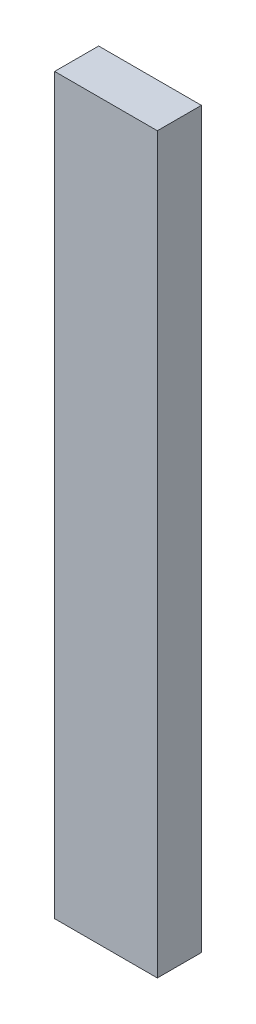
ISO-10303-21;
HEADER;
FILE_DESCRIPTION(('STEP AP214'),'2;1');
FILE_NAME('part.step','',(''),(''),'','','');
FILE_SCHEMA(('AUTOMOTIVE_DESIGN { 1 0 10303 214 1 1 1 1 }'));
ENDSEC;
DATA;
#1=APPLICATION_CONTEXT('core data for automotive mechanical design processes');
#2=APPLICATION_PROTOCOL_DEFINITION('international standard','automotive_design',2000,#1);
#3=PRODUCT_CONTEXT('',#1,'mechanical');
#4=PRODUCT('Part','Part','',(#3));
#5=PRODUCT_RELATED_PRODUCT_CATEGORY('part','',(#4));
#6=PRODUCT_DEFINITION_FORMATION('','',#4);
#7=PRODUCT_DEFINITION_CONTEXT('part definition',#1,'design');
#8=PRODUCT_DEFINITION('design','',#6,#7);
#9=PRODUCT_DEFINITION_SHAPE('','',#8);
#10=(LENGTH_UNIT() NAMED_UNIT(*) SI_UNIT(.MILLI.,.METRE.));
#11=(NAMED_UNIT(*) PLANE_ANGLE_UNIT() SI_UNIT($,.RADIAN.));
#12=(NAMED_UNIT(*) SI_UNIT($,.STERADIAN.) SOLID_ANGLE_UNIT());
#13=UNCERTAINTY_MEASURE_WITH_UNIT(LENGTH_MEASURE(1.E-05),#10,'distance_accuracy_value','');
#14=(GEOMETRIC_REPRESENTATION_CONTEXT(3) GLOBAL_UNCERTAINTY_ASSIGNED_CONTEXT((#13)) GLOBAL_UNIT_ASSIGNED_CONTEXT((#10,
#11,#12)) REPRESENTATION_CONTEXT('',''));
#15=CARTESIAN_POINT('',(0.,0.,0.));
#16=DIRECTION('',(0.,0.,1.));
#17=DIRECTION('',(1.,0.,0.));
#18=AXIS2_PLACEMENT_3D('',#15,#16,#17);
#19=CARTESIAN_POINT('',(0.,635.,0.));
#20=DIRECTION('',(1.,0.,0.));
#21=DIRECTION('',(0.,0.,-1.));
#22=AXIS2_PLACEMENT_3D('',#19,#20,#21);
#23=PLANE('',#22);
#24=DIRECTION('',(0.,0.,1.));
#25=VECTOR('',#24,1.);
#26=CARTESIAN_POINT('',(0.,0.,0.));
#27=LINE('',#26,#25);
#28=CARTESIAN_POINT('',(0.,0.,-38.1));
#29=VERTEX_POINT('',#28);
#30=CARTESIAN_POINT('',(0.,0.,0.));
#31=VERTEX_POINT('',#30);
#32=EDGE_CURVE('E100',#29,#31,#27,.T.);
#33=ORIENTED_EDGE('',*,*,#32,.T.);
#34=DIRECTION('',(0.,-1.,0.));
#35=VECTOR('',#34,1.);
#36=CARTESIAN_POINT('',(0.,635.,0.));
#37=LINE('',#36,#35);
#38=CARTESIAN_POINT('',(0.,635.,0.));
#39=VERTEX_POINT('',#38);
#40=EDGE_CURVE('E11',#39,#31,#37,.T.);
#41=ORIENTED_EDGE('',*,*,#40,.F.);
#42=DIRECTION('',(0.,0.,1.));
#43=VECTOR('',#42,1.);
#44=CARTESIAN_POINT('',(0.,635.,0.));
#45=LINE('',#44,#43);
#46=CARTESIAN_POINT('',(0.,635.,-38.1));
#47=VERTEX_POINT('',#46);
#48=EDGE_CURVE('E88',#47,#39,#45,.T.);
#49=ORIENTED_EDGE('',*,*,#48,.F.);
#50=DIRECTION('',(0.,-1.,0.));
#51=VECTOR('',#50,1.);
#52=CARTESIAN_POINT('',(0.,635.,-38.1));
#53=LINE('',#52,#51);
#54=EDGE_CURVE('E96',#47,#29,#53,.T.);
#55=ORIENTED_EDGE('',*,*,#54,.T.);
#56=EDGE_LOOP('',(#33,#41,#49,#55));
#57=FACE_BOUND('',#56,.T.);
#58=ADVANCED_FACE('F37',(#57),#23,.F.);
#59=CARTESIAN_POINT('',(0.,635.,0.));
#60=DIRECTION('',(0.,0.,-1.));
#61=DIRECTION('',(-1.,0.,0.));
#62=AXIS2_PLACEMENT_3D('',#59,#60,#61);
#63=PLANE('',#62);
#64=DIRECTION('',(1.,0.,0.));
#65=VECTOR('',#64,1.);
#66=CARTESIAN_POINT('',(0.,0.,0.));
#67=LINE('',#66,#65);
#68=CARTESIAN_POINT('',(88.9,0.,0.));
#69=VERTEX_POINT('',#68);
#70=EDGE_CURVE('E92',#31,#69,#67,.T.);
#71=ORIENTED_EDGE('',*,*,#70,.T.);
#72=DIRECTION('',(0.,-1.,0.));
#73=VECTOR('',#72,1.);
#74=CARTESIAN_POINT('',(88.9,635.,0.));
#75=LINE('',#74,#73);
#76=CARTESIAN_POINT('',(88.9,635.,0.));
#77=VERTEX_POINT('',#76);
#78=EDGE_CURVE('E45',#77,#69,#75,.T.);
#79=ORIENTED_EDGE('',*,*,#78,.F.);
#80=DIRECTION('',(1.,0.,0.));
#81=VECTOR('',#80,1.);
#82=CARTESIAN_POINT('',(0.,635.,0.));
#83=LINE('',#82,#81);
#84=EDGE_CURVE('E83',#39,#77,#83,.T.);
#85=ORIENTED_EDGE('',*,*,#84,.F.);
#86=ORIENTED_EDGE('',*,*,#40,.T.);
#87=EDGE_LOOP('',(#71,#79,#85,#86));
#88=FACE_BOUND('',#87,.T.);
#89=ADVANCED_FACE('F91',(#88),#63,.F.);
#90=CARTESIAN_POINT('',(88.9,635.,0.));
#91=DIRECTION('',(-1.,0.,0.));
#92=DIRECTION('',(0.,0.,1.));
#93=AXIS2_PLACEMENT_3D('',#90,#91,#92);
#94=PLANE('',#93);
#95=DIRECTION('',(0.,0.,-1.));
#96=VECTOR('',#95,1.);
#97=CARTESIAN_POINT('',(88.9,0.,0.));
#98=LINE('',#97,#96);
#99=CARTESIAN_POINT('',(88.9,0.,-38.1));
#100=VERTEX_POINT('',#99);
#101=EDGE_CURVE('E70',#69,#100,#98,.T.);
#102=ORIENTED_EDGE('',*,*,#101,.T.);
#103=DIRECTION('',(0.,-1.,0.));
#104=VECTOR('',#103,1.);
#105=CARTESIAN_POINT('',(88.9,635.,-38.1));
#106=LINE('',#105,#104);
#107=CARTESIAN_POINT('',(88.9,635.,-38.1));
#108=VERTEX_POINT('',#107);
#109=EDGE_CURVE('E93',#108,#100,#106,.T.);
#110=ORIENTED_EDGE('',*,*,#109,.F.);
#111=DIRECTION('',(0.,0.,-1.));
#112=VECTOR('',#111,1.);
#113=CARTESIAN_POINT('',(88.9,635.,0.));
#114=LINE('',#113,#112);
#115=EDGE_CURVE('E86',#77,#108,#114,.T.);
#116=ORIENTED_EDGE('',*,*,#115,.F.);
#117=ORIENTED_EDGE('',*,*,#78,.T.);
#118=EDGE_LOOP('',(#102,#110,#116,#117));
#119=FACE_BOUND('',#118,.T.);
#120=ADVANCED_FACE('F94',(#119),#94,.F.);
#121=CARTESIAN_POINT('',(0.,635.,-38.1));
#122=DIRECTION('',(0.,0.,1.));
#123=DIRECTION('',(1.,0.,0.));
#124=AXIS2_PLACEMENT_3D('',#121,#122,#123);
#125=PLANE('',#124);
#126=DIRECTION('',(-1.,0.,0.));
#127=VECTOR('',#126,1.);
#128=CARTESIAN_POINT('',(0.,0.,-38.1));
#129=LINE('',#128,#127);
#130=EDGE_CURVE('E76',#100,#29,#129,.T.);
#131=ORIENTED_EDGE('',*,*,#130,.T.);
#132=ORIENTED_EDGE('',*,*,#54,.F.);
#133=DIRECTION('',(-1.,0.,0.));
#134=VECTOR('',#133,1.);
#135=CARTESIAN_POINT('',(0.,635.,-38.1));
#136=LINE('',#135,#134);
#137=EDGE_CURVE('E53',#108,#47,#136,.T.);
#138=ORIENTED_EDGE('',*,*,#137,.F.);
#139=ORIENTED_EDGE('',*,*,#109,.T.);
#140=EDGE_LOOP('',(#131,#132,#138,#139));
#141=FACE_BOUND('',#140,.T.);
#142=ADVANCED_FACE('F107',(#141),#125,.F.);
#143=CARTESIAN_POINT('',(0.,635.,0.));
#144=DIRECTION('',(0.,-1.,0.));
#145=DIRECTION('',(0.,0.,-1.));
#146=AXIS2_PLACEMENT_3D('',#143,#144,#145);
#147=PLANE('',#146);
#148=ORIENTED_EDGE('',*,*,#48,.T.);
#149=ORIENTED_EDGE('',*,*,#84,.T.);
#150=ORIENTED_EDGE('',*,*,#115,.T.);
#151=ORIENTED_EDGE('',*,*,#137,.T.);
#152=EDGE_LOOP('',(#148,#149,#150,#151));
#153=FACE_BOUND('',#152,.T.);
#154=ADVANCED_FACE('F84',(#153),#147,.F.);
#155=CARTESIAN_POINT('',(0.,0.,0.));
#156=DIRECTION('',(0.,-1.,0.));
#157=DIRECTION('',(0.,0.,-1.));
#158=AXIS2_PLACEMENT_3D('',#155,#156,#157);
#159=PLANE('',#158);
#160=ORIENTED_EDGE('',*,*,#32,.F.);
#161=ORIENTED_EDGE('',*,*,#130,.F.);
#162=ORIENTED_EDGE('',*,*,#101,.F.);
#163=ORIENTED_EDGE('',*,*,#70,.F.);
#164=EDGE_LOOP('',(#160,#161,#162,#163));
#165=FACE_BOUND('',#164,.T.);
#166=ADVANCED_FACE('F110',(#165),#159,.T.);
#167=CLOSED_SHELL('',(#58,#89,#120,#142,#154,#166));
#168=MANIFOLD_SOLID_BREP('B2',#167);
#169=ADVANCED_BREP_SHAPE_REPRESENTATION('',(#18,#168),#14);
#170=SHAPE_DEFINITION_REPRESENTATION(#9,#169);
ENDSEC;
END-ISO-10303-21;
